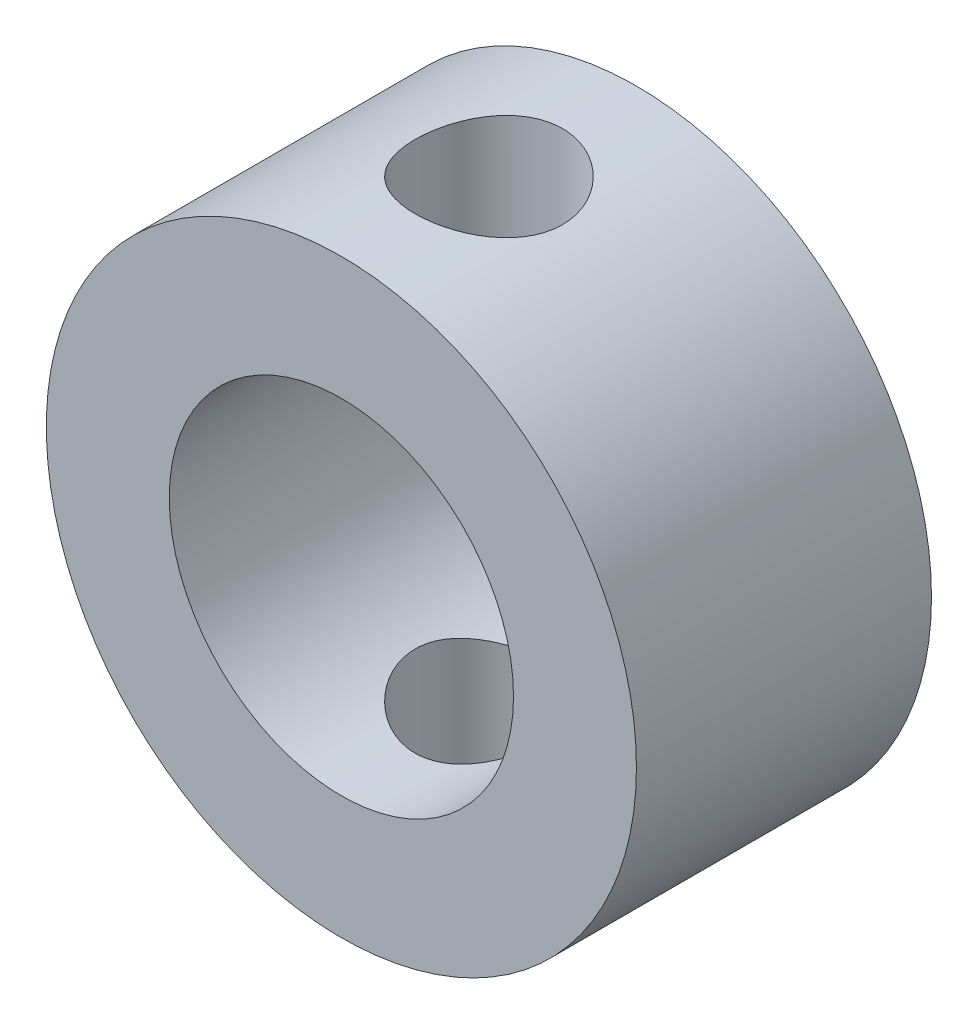
ISO-10303-21;
HEADER;
FILE_DESCRIPTION(('STEP AP214'),'2;1');
FILE_NAME('part.step','',(''),(''),'','','');
FILE_SCHEMA(('AUTOMOTIVE_DESIGN { 1 0 10303 214 1 1 1 1 }'));
ENDSEC;
DATA;
#1=APPLICATION_CONTEXT('core data for automotive mechanical design processes');
#2=APPLICATION_PROTOCOL_DEFINITION('international standard','automotive_design',2000,#1);
#3=PRODUCT_CONTEXT('',#1,'mechanical');
#4=PRODUCT('Part','Part','',(#3));
#5=PRODUCT_RELATED_PRODUCT_CATEGORY('part','',(#4));
#6=PRODUCT_DEFINITION_FORMATION('','',#4);
#7=PRODUCT_DEFINITION_CONTEXT('part definition',#1,'design');
#8=PRODUCT_DEFINITION('design','',#6,#7);
#9=PRODUCT_DEFINITION_SHAPE('','',#8);
#10=(LENGTH_UNIT() NAMED_UNIT(*) SI_UNIT(.MILLI.,.METRE.));
#11=(NAMED_UNIT(*) PLANE_ANGLE_UNIT() SI_UNIT($,.RADIAN.));
#12=(NAMED_UNIT(*) SI_UNIT($,.STERADIAN.) SOLID_ANGLE_UNIT());
#13=UNCERTAINTY_MEASURE_WITH_UNIT(LENGTH_MEASURE(1.E-05),#10,'distance_accuracy_value','');
#14=(GEOMETRIC_REPRESENTATION_CONTEXT(3) GLOBAL_UNCERTAINTY_ASSIGNED_CONTEXT((#13)) GLOBAL_UNIT_ASSIGNED_CONTEXT((#10,
#11,#12)) REPRESENTATION_CONTEXT('',''));
#15=CARTESIAN_POINT('',(0.,0.,0.));
#16=DIRECTION('',(0.,0.,1.));
#17=DIRECTION('',(1.,0.,0.));
#18=AXIS2_PLACEMENT_3D('',#15,#16,#17);
#19=CARTESIAN_POINT('',(0.,0.,12.));
#20=DIRECTION('',(0.,0.,1.));
#21=DIRECTION('',(1.,0.,0.));
#22=AXIS2_PLACEMENT_3D('',#19,#20,#21);
#23=PLANE('',#22);
#24=CARTESIAN_POINT('',(0.,0.,12.));
#25=DIRECTION('',(0.,0.,1.));
#26=DIRECTION('',(1.,0.,0.));
#27=AXIS2_PLACEMENT_3D('',#24,#25,#26);
#28=CIRCLE('',#27,12.);
#29=CARTESIAN_POINT('',(12.,0.,12.));
#30=VERTEX_POINT('',#29);
#31=EDGE_CURVE('E10',#30,#30,#28,.T.);
#32=ORIENTED_EDGE('',*,*,#31,.T.);
#33=EDGE_LOOP('',(#32));
#34=FACE_BOUND('',#33,.T.);
#35=CARTESIAN_POINT('',(0.,0.,12.));
#36=DIRECTION('',(0.,0.,1.));
#37=DIRECTION('',(1.,0.,0.));
#38=AXIS2_PLACEMENT_3D('',#35,#36,#37);
#39=CIRCLE('',#38,7.);
#40=CARTESIAN_POINT('',(7.,0.,12.));
#41=VERTEX_POINT('',#40);
#42=EDGE_CURVE('E49',#41,#41,#39,.T.);
#43=ORIENTED_EDGE('',*,*,#42,.F.);
#44=EDGE_LOOP('',(#43));
#45=FACE_BOUND('',#44,.T.);
#46=ADVANCED_FACE('F31',(#34,#45),#23,.T.);
#47=CARTESIAN_POINT('',(0.,0.,0.));
#48=DIRECTION('',(0.,0.,1.));
#49=DIRECTION('',(1.,0.,0.));
#50=AXIS2_PLACEMENT_3D('',#47,#48,#49);
#51=PLANE('',#50);
#52=CARTESIAN_POINT('',(0.,0.,0.));
#53=DIRECTION('',(0.,0.,1.));
#54=DIRECTION('',(1.,0.,0.));
#55=AXIS2_PLACEMENT_3D('',#52,#53,#54);
#56=CIRCLE('',#55,12.);
#57=CARTESIAN_POINT('',(12.,0.,0.));
#58=VERTEX_POINT('',#57);
#59=EDGE_CURVE('E44',#58,#58,#56,.T.);
#60=ORIENTED_EDGE('',*,*,#59,.F.);
#61=EDGE_LOOP('',(#60));
#62=FACE_BOUND('',#61,.T.);
#63=CARTESIAN_POINT('',(0.,0.,0.));
#64=DIRECTION('',(0.,0.,1.));
#65=DIRECTION('',(1.,0.,0.));
#66=AXIS2_PLACEMENT_3D('',#63,#64,#65);
#67=CIRCLE('',#66,7.);
#68=CARTESIAN_POINT('',(7.,0.,0.));
#69=VERTEX_POINT('',#68);
#70=EDGE_CURVE('E52',#69,#69,#67,.T.);
#71=ORIENTED_EDGE('',*,*,#70,.T.);
#72=EDGE_LOOP('',(#71));
#73=FACE_BOUND('',#72,.T.);
#74=ADVANCED_FACE('F85',(#62,#73),#51,.F.);
#75=CARTESIAN_POINT('',(0.,0.,12.));
#76=DIRECTION('',(0.,0.,-1.));
#77=DIRECTION('',(-1.,0.,0.));
#78=AXIS2_PLACEMENT_3D('',#75,#76,#77);
#79=CYLINDRICAL_SURFACE('',#78,12.);
#80=CARTESIAN_POINT('',(0.,-12.,9.));
#81=CARTESIAN_POINT('',(0.165752177339466,-11.9999971973602,8.99999534852368));
#82=CARTESIAN_POINT('',(0.33155631566153,-11.9965315626365,8.98621689845243));
#83=CARTESIAN_POINT('',(0.658412647541069,-11.9830422765979,8.93154969738599));
#84=CARTESIAN_POINT('',(0.819462093741482,-11.9730149083995,8.8906455809243));
#85=CARTESIAN_POINT('',(1.13204174436516,-11.9475125266406,8.78312149307583));
#86=CARTESIAN_POINT('',(1.28358312686001,-11.9320440568412,8.71653240256946));
#87=CARTESIAN_POINT('',(1.57334426380886,-11.8973068761524,8.55963721991032));
#88=CARTESIAN_POINT('',(1.71156356869753,-11.8780380370831,8.46933032776206));
#89=CARTESIAN_POINT('',(1.97360385460183,-11.8373482718339,8.26559842069164));
#90=CARTESIAN_POINT('',(2.09711138012212,-11.8158941429625,8.15177685008188));
#91=CARTESIAN_POINT('',(2.32349785440664,-11.7734724023587,7.90509559018193));
#92=CARTESIAN_POINT('',(2.42637447389839,-11.7525048457974,7.77223375410613));
#93=CARTESIAN_POINT('',(2.61005308559795,-11.7130955139634,7.48880954652602));
#94=CARTESIAN_POINT('',(2.69050443185028,-11.6946958892962,7.33801353838254));
#95=CARTESIAN_POINT('',(2.82479381710149,-11.6629898963603,7.02450317667993));
#96=CARTESIAN_POINT('',(2.87863611088029,-11.6496827138884,6.86179073333597));
#97=CARTESIAN_POINT('',(2.95710967360953,-11.6300095339265,6.53251300359668));
#98=CARTESIAN_POINT('',(2.98230453666411,-11.6235098199402,6.36609020792401));
#99=CARTESIAN_POINT('',(3.00452355013282,-11.6177872491918,6.03126286200131));
#100=CARTESIAN_POINT('',(3.00155228363623,-11.6185632085586,5.86285863861572));
#101=CARTESIAN_POINT('',(2.96797304927941,-11.6271841103363,5.53316838450929));
#102=CARTESIAN_POINT('',(2.93803668038127,-11.6348572601459,5.37180875706934));
#103=CARTESIAN_POINT('',(2.85244837380599,-11.6561341934214,5.05647789817788));
#104=CARTESIAN_POINT('',(2.79679460413879,-11.6697383993848,4.90250719394216));
#105=CARTESIAN_POINT('',(2.66077895587437,-11.7015022781132,4.60452396749574));
#106=CARTESIAN_POINT('',(2.58017333446584,-11.7197065493963,4.46062765642086));
#107=CARTESIAN_POINT('',(2.39671255202989,-11.7585942169198,4.18816258048636));
#108=CARTESIAN_POINT('',(2.29385349761768,-11.7792780466926,4.0595965038655));
#109=CARTESIAN_POINT('',(2.06532684936244,-11.8215176107978,3.81759276861119));
#110=CARTESIAN_POINT('',(1.93909251633172,-11.84308138956,3.7046910198773));
#111=CARTESIAN_POINT('',(1.6692238350074,-11.8841193115751,3.50155751507219));
#112=CARTESIAN_POINT('',(1.52558895541589,-11.9035933909882,3.41132645147287));
#113=CARTESIAN_POINT('',(1.22423177736279,-11.9383546418838,3.25589882755123));
#114=CARTESIAN_POINT('',(1.06646278641725,-11.9536272025545,3.19078931949114));
#115=CARTESIAN_POINT('',(0.741752016285768,-11.9781583398283,3.08816538858085));
#116=CARTESIAN_POINT('',(0.574811998300971,-11.9874180667856,3.05064568716372));
#117=CARTESIAN_POINT('',(0.241079940780055,-11.9987099854275,3.00508486888232));
#118=CARTESIAN_POINT('',(0.0743934399764211,-12.0009210701655,2.9963139478494));
#119=CARTESIAN_POINT('',(-0.258065749603016,-11.998376096289,3.00649800411098));
#120=CARTESIAN_POINT('',(-0.423838519289191,-11.9936206648371,3.02545048559827));
#121=CARTESIAN_POINT('',(-0.747228537552979,-11.977791622547,3.08994181678275));
#122=CARTESIAN_POINT('',(-0.904930237937499,-11.9668126837158,3.13508252695395));
#123=CARTESIAN_POINT('',(-1.21051458490503,-11.9397741326831,3.25021416805692));
#124=CARTESIAN_POINT('',(-1.3583962380653,-11.9237140073996,3.32020760862644));
#125=CARTESIAN_POINT('',(-1.64304626885966,-11.8878661585244,3.48447225774935));
#126=CARTESIAN_POINT('',(-1.77957088367153,-11.868017347332,3.57915222479313));
#127=CARTESIAN_POINT('',(-2.03505322728662,-11.826890183755,3.78957981759434));
#128=CARTESIAN_POINT('',(-2.15400791794649,-11.8056115850589,3.9053310792353));
#129=CARTESIAN_POINT('',(-2.37398113614497,-11.76337913919,4.15800392168741));
#130=CARTESIAN_POINT('',(-2.4744877352422,-11.7424460836496,4.29537540599912));
#131=CARTESIAN_POINT('',(-2.65102151802725,-11.7038575676408,4.58546526893716));
#132=CARTESIAN_POINT('',(-2.72704978832281,-11.6862019616993,4.73818296594089));
#133=CARTESIAN_POINT('',(-2.85190284121468,-11.656361894336,5.05381144481248));
#134=CARTESIAN_POINT('',(-2.90088879328717,-11.6441451045097,5.2166552566246));
#135=CARTESIAN_POINT('',(-2.97069131988587,-11.626534880479,5.54861927571059));
#136=CARTESIAN_POINT('',(-2.99151405495182,-11.6211399540485,5.7177381020429));
#137=CARTESIAN_POINT('',(-3.00407718067299,-11.6178980244194,6.05224204772322));
#138=CARTESIAN_POINT('',(-2.99663579556157,-11.6198386546564,6.21759487025289));
#139=CARTESIAN_POINT('',(-2.95475455662439,-11.6305581800657,6.54460777733253));
#140=CARTESIAN_POINT('',(-2.92031524537318,-11.6393369378128,6.70626793602638));
#141=CARTESIAN_POINT('',(-2.82586263888594,-11.6626252136787,7.02041691813173));
#142=CARTESIAN_POINT('',(-2.76600280936084,-11.6771003047327,7.17295461048066));
#143=CARTESIAN_POINT('',(-2.62252982721004,-11.7101551144901,7.46593076542714));
#144=CARTESIAN_POINT('',(-2.53891338006835,-11.7287354024137,7.60636754637377));
#145=CARTESIAN_POINT('',(-2.34773549727429,-11.7685126852721,7.87510925800411));
#146=CARTESIAN_POINT('',(-2.23960632582451,-11.7897652966356,8.00300214684794));
#147=CARTESIAN_POINT('',(-2.00357874237946,-11.8321605449252,8.2390940895908));
#148=CARTESIAN_POINT('',(-1.87567564252228,-11.8533031545411,8.34728846022593));
#149=CARTESIAN_POINT('',(-1.60093517340518,-11.8935531129534,8.54282261712922));
#150=CARTESIAN_POINT('',(-1.45379684463277,-11.9126166673174,8.62974922734316));
#151=CARTESIAN_POINT('',(-1.14653211902095,-11.9460984995023,8.77749492588106));
#152=CARTESIAN_POINT('',(-0.986415126873474,-11.9605201039956,8.83833272129707));
#153=CARTESIAN_POINT('',(-0.688820506486939,-11.9809611913108,8.92314366065931));
#154=CARTESIAN_POINT('',(-0.552760341816133,-11.9880517010538,8.95190248610687));
#155=CARTESIAN_POINT('',(-0.277812143072562,-11.997572104639,8.99033188724388));
#156=CARTESIAN_POINT('',(-0.138924322485229,-12.0000023490179,9.0000038986106));
#157=CARTESIAN_POINT('',(0.,-12.,9.));
#158=B_SPLINE_CURVE_WITH_KNOTS('',3,(#80,#81,#82,#83,#84,#85,#86,#87,#88,#89,#90,#91,#92,#93,
#94,#95,#96,#97,#98,#99,#100,#101,#102,#103,#104,#105,#106,#107,#108,#109,#110,#111,#112,#113,
#114,#115,#116,#117,#118,#119,#120,#121,#122,#123,#124,#125,#126,#127,#128,#129,#130,#131,#132,
#133,#134,#135,#136,#137,#138,#139,#140,#141,#142,#143,#144,#145,#146,#147,#148,#149,#150,#151,
#152,#153,#154,#155,#156,#157),.UNSPECIFIED.,.T.,.F.,(4,2,2,2,2,2,2,2,2,2,2,2,2,2,2,2,2,2,2,2,2,
2,2,2,2,2,2,2,2,2,2,2,2,2,2,2,2,2,4),(0.,0.496747424943779,0.993776475527799,1.49020980457221,
1.98665988033866,2.49228870874278,2.99797459160124,3.51117295091614,4.02428922338737,
4.5271259020214,5.02988076232035,5.52044994020678,6.01105406938718,6.506610557544,
7.00225381678967,7.5120300194468,8.02182179123136,8.5333645802487,9.04480947383927,
9.54316617905194,10.0414780223213,10.5324054903472,11.0233825465122,11.5230717513735,
12.0228472602268,12.5348901841559,13.0469103750566,13.5558450923716,14.0646684651657,
14.5588756080898,15.0530728192383,15.5443280113065,16.0356513628556,16.5397915283158,
17.0440513955259,17.5574437101093,18.0704672765446,18.4868448589605,18.9031911209784),.UNSPECIFIED.);
#159=CARTESIAN_POINT('',(0.,-12.,9.));
#160=VERTEX_POINT('',#159);
#161=EDGE_CURVE('E75',#160,#160,#158,.T.);
#162=ORIENTED_EDGE('',*,*,#161,.T.);
#163=EDGE_LOOP('',(#162));
#164=FACE_BOUND('',#163,.T.);
#165=CARTESIAN_POINT('',(0.,12.,9.));
#166=CARTESIAN_POINT('',(-0.165752177339462,11.9999971973602,8.99999534852368));
#167=CARTESIAN_POINT('',(-0.331556315661526,11.9965315626365,8.98621689845242));
#168=CARTESIAN_POINT('',(-0.658412647541065,11.9830422765979,8.93154969738599));
#169=CARTESIAN_POINT('',(-0.819462093741479,11.9730149083995,8.8906455809243));
#170=CARTESIAN_POINT('',(-1.13204174436515,11.9475125266406,8.78312149307583));
#171=CARTESIAN_POINT('',(-1.28358312686,11.9320440568412,8.71653240256946));
#172=CARTESIAN_POINT('',(-1.57334426380886,11.8973068761524,8.55963721991031));
#173=CARTESIAN_POINT('',(-1.71156356869753,11.8780380370831,8.46933032776206));
#174=CARTESIAN_POINT('',(-1.97360385460183,11.8373482718339,8.26559842069164));
#175=CARTESIAN_POINT('',(-2.09711138012211,11.8158941429625,8.15177685008188));
#176=CARTESIAN_POINT('',(-2.32349785440664,11.7734724023587,7.90509559018193));
#177=CARTESIAN_POINT('',(-2.42637447389838,11.7525048457974,7.77223375410612));
#178=CARTESIAN_POINT('',(-2.61005308559795,11.7130955139634,7.48880954652601));
#179=CARTESIAN_POINT('',(-2.69050443185028,11.6946958892962,7.33801353838254));
#180=CARTESIAN_POINT('',(-2.82479381710149,11.6629898963603,7.02450317667992));
#181=CARTESIAN_POINT('',(-2.87863611088028,11.6496827138884,6.86179073333596));
#182=CARTESIAN_POINT('',(-2.95710967360953,11.6300095339265,6.53251300359668));
#183=CARTESIAN_POINT('',(-2.9823045366641,11.6235098199402,6.36609020792401));
#184=CARTESIAN_POINT('',(-3.00452355013281,11.6177872491918,6.0312628620013));
#185=CARTESIAN_POINT('',(-3.00155228363622,11.6185632085586,5.86285863861572));
#186=CARTESIAN_POINT('',(-2.96797304927941,11.6271841103363,5.53316838450929));
#187=CARTESIAN_POINT('',(-2.93803668038126,11.6348572601459,5.37180875706934));
#188=CARTESIAN_POINT('',(-2.85244837380598,11.6561341934214,5.05647789817788));
#189=CARTESIAN_POINT('',(-2.79679460413878,11.6697383993848,4.90250719394216));
#190=CARTESIAN_POINT('',(-2.66077895587436,11.7015022781132,4.60452396749574));
#191=CARTESIAN_POINT('',(-2.58017333446583,11.7197065493963,4.46062765642086));
#192=CARTESIAN_POINT('',(-2.39671255202989,11.7585942169198,4.18816258048636));
#193=CARTESIAN_POINT('',(-2.29385349761767,11.7792780466926,4.0595965038655));
#194=CARTESIAN_POINT('',(-2.06532684936244,11.8215176107978,3.81759276861119));
#195=CARTESIAN_POINT('',(-1.93909251633172,11.84308138956,3.7046910198773));
#196=CARTESIAN_POINT('',(-1.66922383500739,11.8841193115751,3.50155751507219));
#197=CARTESIAN_POINT('',(-1.52558895541588,11.9035933909882,3.41132645147287));
#198=CARTESIAN_POINT('',(-1.22423177736278,11.9383546418838,3.25589882755123));
#199=CARTESIAN_POINT('',(-1.06646278641724,11.9536272025545,3.19078931949114));
#200=CARTESIAN_POINT('',(-0.741752016285759,11.9781583398283,3.08816538858085));
#201=CARTESIAN_POINT('',(-0.574811998300963,11.9874180667856,3.05064568716372));
#202=CARTESIAN_POINT('',(-0.241079940780047,11.9987099854275,3.00508486888232));
#203=CARTESIAN_POINT('',(-0.0743934399764138,12.0009210701655,2.9963139478494));
#204=CARTESIAN_POINT('',(0.258065749603023,11.998376096289,3.00649800411098));
#205=CARTESIAN_POINT('',(0.423838519289199,11.9936206648371,3.02545048559827));
#206=CARTESIAN_POINT('',(0.747228537552988,11.977791622547,3.08994181678275));
#207=CARTESIAN_POINT('',(0.904930237937507,11.9668126837158,3.13508252695395));
#208=CARTESIAN_POINT('',(1.21051458490504,11.9397741326831,3.25021416805692));
#209=CARTESIAN_POINT('',(1.35839623806531,11.9237140073996,3.32020760862645));
#210=CARTESIAN_POINT('',(1.64304626885967,11.8878661585244,3.48447225774935));
#211=CARTESIAN_POINT('',(1.77957088367154,11.868017347332,3.57915222479313));
#212=CARTESIAN_POINT('',(2.03505322728663,11.826890183755,3.78957981759434));
#213=CARTESIAN_POINT('',(2.1540079179465,11.8056115850589,3.9053310792353));
#214=CARTESIAN_POINT('',(2.37398113614497,11.76337913919,4.15800392168742));
#215=CARTESIAN_POINT('',(2.47448773524221,11.7424460836496,4.29537540599912));
#216=CARTESIAN_POINT('',(2.65102151802726,11.7038575676408,4.58546526893716));
#217=CARTESIAN_POINT('',(2.72704978832282,11.6862019616993,4.73818296594089));
#218=CARTESIAN_POINT('',(2.85190284121469,11.656361894336,5.05381144481248));
#219=CARTESIAN_POINT('',(2.90088879328718,11.6441451045097,5.2166552566246));
#220=CARTESIAN_POINT('',(2.97069131988587,11.626534880479,5.54861927571059));
#221=CARTESIAN_POINT('',(2.99151405495183,11.6211399540485,5.7177381020429));
#222=CARTESIAN_POINT('',(3.004077180673,11.6178980244194,6.05224204772322));
#223=CARTESIAN_POINT('',(2.99663579556158,11.6198386546564,6.2175948702529));
#224=CARTESIAN_POINT('',(2.95475455662439,11.6305581800657,6.54460777733253));
#225=CARTESIAN_POINT('',(2.92031524537318,11.6393369378128,6.70626793602639));
#226=CARTESIAN_POINT('',(2.82586263888595,11.6626252136787,7.02041691813173));
#227=CARTESIAN_POINT('',(2.76600280936085,11.6771003047327,7.17295461048066));
#228=CARTESIAN_POINT('',(2.62252982721005,11.7101551144901,7.46593076542714));
#229=CARTESIAN_POINT('',(2.53891338006835,11.7287354024137,7.60636754637377));
#230=CARTESIAN_POINT('',(2.3477354972743,11.7685126852721,7.87510925800411));
#231=CARTESIAN_POINT('',(2.23960632582452,11.7897652966356,8.00300214684794));
#232=CARTESIAN_POINT('',(2.00357874237947,11.8321605449252,8.2390940895908));
#233=CARTESIAN_POINT('',(1.87567564252229,11.8533031545411,8.34728846022593));
#234=CARTESIAN_POINT('',(1.60093517340518,11.8935531129534,8.54282261712922));
#235=CARTESIAN_POINT('',(1.45379684463277,11.9126166673174,8.62974922734316));
#236=CARTESIAN_POINT('',(1.14653211902095,11.9460984995023,8.77749492588106));
#237=CARTESIAN_POINT('',(0.986415126873479,11.9605201039956,8.83833272129707));
#238=CARTESIAN_POINT('',(0.688820506486944,11.9809611913108,8.92314366065931));
#239=CARTESIAN_POINT('',(0.552760341816137,11.9880517010538,8.95190248610687));
#240=CARTESIAN_POINT('',(0.277812143072567,11.997572104639,8.99033188724388));
#241=CARTESIAN_POINT('',(0.138924322485233,12.0000023490179,9.0000038986106));
#242=CARTESIAN_POINT('',(0.,12.,9.));
#243=B_SPLINE_CURVE_WITH_KNOTS('',3,(#165,#166,#167,#168,#169,#170,#171,#172,#173,#174,#175,
#176,#177,#178,#179,#180,#181,#182,#183,#184,#185,#186,#187,#188,#189,#190,#191,#192,#193,#194,
#195,#196,#197,#198,#199,#200,#201,#202,#203,#204,#205,#206,#207,#208,#209,#210,#211,#212,#213,
#214,#215,#216,#217,#218,#219,#220,#221,#222,#223,#224,#225,#226,#227,#228,#229,#230,#231,#232,
#233,#234,#235,#236,#237,#238,#239,#240,#241,#242),.UNSPECIFIED.,.T.,.F.,(4,2,2,2,2,2,2,2,2,2,2,
2,2,2,2,2,2,2,2,2,2,2,2,2,2,2,2,2,2,2,2,2,2,2,2,2,2,2,4),(0.,0.496747424943779,
0.993776475527799,1.49020980457221,1.98665988033866,2.49228870874278,2.99797459160124,
3.51117295091614,4.02428922338737,4.5271259020214,5.02988076232035,5.52044994020677,
6.01105406938718,6.506610557544,7.00225381678967,7.5120300194468,8.02182179123135,
8.53336458024869,9.04480947383927,9.54316617905194,10.0414780223213,10.5324054903472,
11.0233825465122,11.5230717513735,12.0228472602268,12.5348901841559,13.0469103750566,
13.5558450923716,14.0646684651657,14.5588756080898,15.0530728192382,15.5443280113065,
16.0356513628556,16.5397915283158,17.0440513955259,17.5574437101093,18.0704672765446,
18.4868448589605,18.9031911209784),.UNSPECIFIED.);
#244=CARTESIAN_POINT('',(0.,12.,9.));
#245=VERTEX_POINT('',#244);
#246=EDGE_CURVE('E71',#245,#245,#243,.T.);
#247=ORIENTED_EDGE('',*,*,#246,.T.);
#248=EDGE_LOOP('',(#247));
#249=FACE_BOUND('',#248,.T.);
#250=ORIENTED_EDGE('',*,*,#31,.F.);
#251=EDGE_LOOP('',(#250));
#252=FACE_BOUND('',#251,.T.);
#253=ORIENTED_EDGE('',*,*,#59,.T.);
#254=EDGE_LOOP('',(#253));
#255=FACE_BOUND('',#254,.T.);
#256=ADVANCED_FACE('F33',(#164,#249,#252,#255),#79,.T.);
#257=CARTESIAN_POINT('',(0.,0.,12.));
#258=DIRECTION('',(0.,0.,-1.));
#259=DIRECTION('',(-1.,0.,0.));
#260=AXIS2_PLACEMENT_3D('',#257,#258,#259);
#261=CYLINDRICAL_SURFACE('',#260,7.);
#262=CARTESIAN_POINT('',(0.,-7.,9.));
#263=CARTESIAN_POINT('',(0.160281740269094,-6.9999940839629,8.99999253041855));
#264=CARTESIAN_POINT('',(0.320833907522433,-6.99443250051265,8.98707868390345));
#265=CARTESIAN_POINT('',(0.637349314958988,-6.97273920628719,8.93591763457354));
#266=CARTESIAN_POINT('',(0.793299928144209,-6.95658080950724,8.89760647092665));
#267=CARTESIAN_POINT('',(1.0955347051483,-6.91541630739346,8.79733023637488));
#268=CARTESIAN_POINT('',(1.24185033642246,-6.89044089228941,8.7354471561946));
#269=CARTESIAN_POINT('',(1.5218733278968,-6.83405660276648,8.59013558143627));
#270=CARTESIAN_POINT('',(1.65558409053381,-6.80264947176647,8.5067129239082));
#271=CARTESIAN_POINT('',(1.91384144205639,-6.73467821875549,8.3160723523121));
#272=CARTESIAN_POINT('',(2.03764045493603,-6.69793895962371,8.20790474010422));
#273=CARTESIAN_POINT('',(2.26599040232609,-6.62417654338771,7.97285613149923));
#274=CARTESIAN_POINT('',(2.3705306503261,-6.5871532404671,7.84596481539728));
#275=CARTESIAN_POINT('',(2.56285686126493,-6.51482055271223,7.5689672772845));
#276=CARTESIAN_POINT('',(2.64946811752636,-6.47970460244924,7.41798954197069));
#277=CARTESIAN_POINT('',(2.79573199408101,-6.41796168635026,7.10189057181104));
#278=CARTESIAN_POINT('',(2.8553992914263,-6.39133010120133,6.93677709551375));
#279=CARTESIAN_POINT('',(2.94294919918375,-6.35147799087276,6.60569926169075));
#280=CARTESIAN_POINT('',(2.97227494401777,-6.33765221435539,6.44019229822055));
#281=CARTESIAN_POINT('',(3.00280607158394,-6.32324849688131,6.10607403038965));
#282=CARTESIAN_POINT('',(3.00402828615096,-6.32266262625149,5.93746464470862));
#283=CARTESIAN_POINT('',(2.97939999510613,-6.33429573902539,5.61670009628145));
#284=CARTESIAN_POINT('',(2.95576113815072,-6.34546870930158,5.46432937666801));
#285=CARTESIAN_POINT('',(2.88580772808799,-6.37758411517576,5.16597241409867));
#286=CARTESIAN_POINT('',(2.83948852833539,-6.39852855266591,5.01998748611386));
#287=CARTESIAN_POINT('',(2.72457659070691,-6.44830685655465,4.73475284856477));
#288=CARTESIAN_POINT('',(2.65551974428426,-6.47730295111391,4.59571970578185));
#289=CARTESIAN_POINT('',(2.49742304873013,-6.53988493882129,4.33065367593057));
#290=CARTESIAN_POINT('',(2.4083750748049,-6.57347269593628,4.20462610507051));
#291=CARTESIAN_POINT('',(2.20343405392229,-6.64512404535213,3.95722249637862));
#292=CARTESIAN_POINT('',(2.08584728856133,-6.68331855389208,3.83728327052803));
#293=CARTESIAN_POINT('',(1.83187332405077,-6.75734605758523,3.61832840934405));
#294=CARTESIAN_POINT('',(1.6954812162799,-6.79317843254652,3.51931825412179));
#295=CARTESIAN_POINT('',(1.40318582301272,-6.8595969368957,3.34275606719303));
#296=CARTESIAN_POINT('',(1.24687114970232,-6.89002455033727,3.26582098129442));
#297=CARTESIAN_POINT('',(0.921879694158938,-6.94097396260558,3.13984976238528));
#298=CARTESIAN_POINT('',(0.753210215657668,-6.9615015603998,3.0907972940223));
#299=CARTESIAN_POINT('',(0.420276238941373,-6.98923526893385,3.02506613954103));
#300=CARTESIAN_POINT('',(0.256457961010927,-6.99723249964589,3.00646123468561));
#301=CARTESIAN_POINT('',(-0.0721433011185043,-7.00155416651738,2.99637042359177));
#302=CARTESIAN_POINT('',(-0.236925971900554,-6.99788220531666,3.00487614746763));
#303=CARTESIAN_POINT('',(-0.553542439626669,-6.9797867632015,3.04741563205481));
#304=CARTESIAN_POINT('',(-0.705598931504215,-6.96594519473644,3.08006832144833));
#305=CARTESIAN_POINT('',(-1.00189113639242,-6.92953888009974,3.16802089423817));
#306=CARTESIAN_POINT('',(-1.14612587370002,-6.90697304848521,3.22332359572216));
#307=CARTESIAN_POINT('',(-1.42777696523888,-6.8543875151372,3.35680115950212));
#308=CARTESIAN_POINT('',(-1.56483974951836,-6.82415705388474,3.43563633022606));
#309=CARTESIAN_POINT('',(-1.82428490564705,-6.75942988391438,3.61321894447594));
#310=CARTESIAN_POINT('',(-1.94666097512992,-6.72493135648758,3.71197488802329));
#311=CARTESIAN_POINT('',(-2.18296759532595,-6.65214788697903,3.9352895878429));
#312=CARTESIAN_POINT('',(-2.29556617553685,-6.61377354998591,4.06123221006139));
#313=CARTESIAN_POINT('',(-2.49843431443676,-6.53984037690253,4.33078229863161));
#314=CARTESIAN_POINT('',(-2.58869766421195,-6.50428232556792,4.47439466037483));
#315=CARTESIAN_POINT('',(-2.74563875632303,-6.4396296928532,4.77881385295857));
#316=CARTESIAN_POINT('',(-2.81186415020233,-6.41066255987443,4.93988300904999));
#317=CARTESIAN_POINT('',(-2.91565885028324,-6.36413607530145,5.2725263267395));
#318=CARTESIAN_POINT('',(-2.95325364225747,-6.346566580073,5.44409099832458));
#319=CARTESIAN_POINT('',(-2.99611948419969,-6.32643481136621,5.77799117233295));
#320=CARTESIAN_POINT('',(-3.00374693238451,-6.3227792566546,5.93995926751059));
#321=CARTESIAN_POINT('',(-2.99282649265777,-6.32795618271386,6.2627897469115));
#322=CARTESIAN_POINT('',(-2.97428322126542,-6.33678646098226,6.42365232111928));
#323=CARTESIAN_POINT('',(-2.91356431394149,-6.36491653890771,6.73104169627336));
#324=CARTESIAN_POINT('',(-2.87266975661121,-6.38364713099396,6.87787879157075));
#325=CARTESIAN_POINT('',(-2.769702223632,-6.42898875831973,7.16262076608388));
#326=CARTESIAN_POINT('',(-2.70762322652258,-6.45560203384716,7.30052309240773));
#327=CARTESIAN_POINT('',(-2.55963250501148,-6.5157524732596,7.57282070867956));
#328=CARTESIAN_POINT('',(-2.47248232196069,-6.5496164957701,7.70646915369476));
#329=CARTESIAN_POINT('',(-2.27849600925129,-6.61959778926567,7.95798236124754));
#330=CARTESIAN_POINT('',(-2.17165243666714,-6.6557159087398,8.07584112704921));
#331=CARTESIAN_POINT('',(-1.93135048700132,-6.72955424641834,8.30200363550072));
#332=CARTESIAN_POINT('',(-1.79645724733278,-6.76717599448736,8.40881956557276));
#333=CARTESIAN_POINT('',(-1.50919760355,-6.83696477009089,8.59843976003117));
#334=CARTESIAN_POINT('',(-1.35682332068822,-6.86912932173673,8.68123313759985));
#335=CARTESIAN_POINT('',(-1.11954532843041,-6.91035442086788,8.78459269098953));
#336=CARTESIAN_POINT('',(-1.0395728802483,-6.92286397965452,8.81543329080184));
#337=CARTESIAN_POINT('',(-0.876970802782693,-6.94533202163241,8.8702382020223));
#338=CARTESIAN_POINT('',(-0.794342461515163,-6.95529172101822,8.89420579227536));
#339=CARTESIAN_POINT('',(-0.627265567421394,-6.97234378079151,8.93494771728342));
#340=CARTESIAN_POINT('',(-0.542821986677283,-6.97944312738119,8.95173958438048));
#341=CARTESIAN_POINT('',(-0.372647906839311,-6.99059319635283,8.97800871420341));
#342=CARTESIAN_POINT('',(-0.286918376030201,-6.99464610559385,8.9874912240139));
#343=CARTESIAN_POINT('',(-0.167492669563771,-6.99807592564235,8.99550827494356));
#344=CARTESIAN_POINT('',(-0.134021137958661,-6.99879677015532,8.99719185411763));
#345=CARTESIAN_POINT('',(-0.0670370145842062,-6.99975942751561,8.99943850128407));
#346=CARTESIAN_POINT('',(-0.0335244225617017,-7.0000012373944,9.00000156233271));
#347=CARTESIAN_POINT('',(0.,-7.,9.));
#348=B_SPLINE_CURVE_WITH_KNOTS('',3,(#262,#263,#264,#265,#266,#267,#268,#269,#270,#271,#272,
#273,#274,#275,#276,#277,#278,#279,#280,#281,#282,#283,#284,#285,#286,#287,#288,#289,#290,#291,
#292,#293,#294,#295,#296,#297,#298,#299,#300,#301,#302,#303,#304,#305,#306,#307,#308,#309,#310,
#311,#312,#313,#314,#315,#316,#317,#318,#319,#320,#321,#322,#323,#324,#325,#326,#327,#328,#329,
#330,#331,#332,#333,#334,#335,#336,#337,#338,#339,#340,#341,#342,#343,#344,#345,#346,#347),
.UNSPECIFIED.,.T.,.F.,(4,2,2,2,2,2,2,2,2,2,2,2,2,2,2,2,2,2,2,2,2,2,2,2,2,2,2,2,2,2,2,2,2,2,2,2,
2,2,2,2,2,2,4),(0.,0.480714322748849,0.962643903423347,1.44291226275142,1.92305060961531,
2.42622743558506,2.92968263421743,3.45969560860062,3.98941952228263,4.492594268281,
4.99546764377915,5.45710720323576,5.91884138089948,6.3906540887232,6.86265889892286,
7.37709837725841,7.89167239108963,8.41947244601234,8.94696296364742,9.43957347502028,
9.93203191709568,10.3983119423363,10.8646499992176,11.3455505516221,11.8266567358409,
12.3440285038672,12.8615439335848,13.3883469079738,13.9146803943341,14.3986848887267,
14.882604015318,15.341320451094,15.8001673810816,16.2874475008663,16.7749121624767,
17.3008416934143,17.8270092002163,18.0865840789243,18.3460349177801,18.6048481685098,
18.8634754544625,18.964020720529,19.0645666096629),.UNSPECIFIED.);
#349=CARTESIAN_POINT('',(0.,-7.,9.));
#350=VERTEX_POINT('',#349);
#351=EDGE_CURVE('E36',#350,#350,#348,.T.);
#352=ORIENTED_EDGE('',*,*,#351,.F.);
#353=EDGE_LOOP('',(#352));
#354=FACE_BOUND('',#353,.T.);
#355=CARTESIAN_POINT('',(0.,7.,9.));
#356=CARTESIAN_POINT('',(-0.160281740269088,6.9999940839629,8.99999253041855));
#357=CARTESIAN_POINT('',(-0.320833907522426,6.99443250051265,8.98707868390345));
#358=CARTESIAN_POINT('',(-0.637349314958981,6.97273920628719,8.93591763457354));
#359=CARTESIAN_POINT('',(-0.793299928144203,6.95658080950724,8.89760647092665));
#360=CARTESIAN_POINT('',(-1.09553470514829,6.91541630739346,8.79733023637488));
#361=CARTESIAN_POINT('',(-1.24185033642245,6.89044089228941,8.7354471561946));
#362=CARTESIAN_POINT('',(-1.5218733278968,6.83405660276648,8.59013558143627));
#363=CARTESIAN_POINT('',(-1.6555840905338,6.80264947176647,8.5067129239082));
#364=CARTESIAN_POINT('',(-1.91384144205638,6.7346782187555,8.3160723523121));
#365=CARTESIAN_POINT('',(-2.03764045493602,6.69793895962371,8.20790474010422));
#366=CARTESIAN_POINT('',(-2.26599040232609,6.62417654338771,7.97285613149922));
#367=CARTESIAN_POINT('',(-2.3705306503261,6.5871532404671,7.84596481539728));
#368=CARTESIAN_POINT('',(-2.56285686126492,6.51482055271223,7.5689672772845));
#369=CARTESIAN_POINT('',(-2.64946811752636,6.47970460244924,7.41798954197069));
#370=CARTESIAN_POINT('',(-2.795731994081,6.41796168635027,7.10189057181103));
#371=CARTESIAN_POINT('',(-2.8553992914263,6.39133010120133,6.93677709551375));
#372=CARTESIAN_POINT('',(-2.94294919918374,6.35147799087276,6.60569926169075));
#373=CARTESIAN_POINT('',(-2.97227494401776,6.3376522143554,6.44019229822054));
#374=CARTESIAN_POINT('',(-3.00280607158394,6.32324849688131,6.10607403038965));
#375=CARTESIAN_POINT('',(-3.00402828615095,6.3226626262515,5.93746464470862));
#376=CARTESIAN_POINT('',(-2.97939999510613,6.3342957390254,5.61670009628145));
#377=CARTESIAN_POINT('',(-2.95576113815071,6.34546870930158,5.464329376668));
#378=CARTESIAN_POINT('',(-2.88580772808799,6.37758411517576,5.16597241409867));
#379=CARTESIAN_POINT('',(-2.83948852833538,6.39852855266592,5.01998748611386));
#380=CARTESIAN_POINT('',(-2.7245765907069,6.44830685655466,4.73475284856477));
#381=CARTESIAN_POINT('',(-2.65551974428425,6.47730295111391,4.59571970578186));
#382=CARTESIAN_POINT('',(-2.49742304873013,6.53988493882129,4.33065367593057));
#383=CARTESIAN_POINT('',(-2.40837507480489,6.57347269593628,4.20462610507051));
#384=CARTESIAN_POINT('',(-2.20343405392229,6.64512404535213,3.95722249637862));
#385=CARTESIAN_POINT('',(-2.08584728856133,6.68331855389209,3.83728327052803));
#386=CARTESIAN_POINT('',(-1.83187332405076,6.75734605758523,3.61832840934405));
#387=CARTESIAN_POINT('',(-1.69548121627989,6.79317843254652,3.51931825412179));
#388=CARTESIAN_POINT('',(-1.40318582301271,6.8595969368957,3.34275606719303));
#389=CARTESIAN_POINT('',(-1.24687114970231,6.89002455033727,3.26582098129442));
#390=CARTESIAN_POINT('',(-0.921879694158932,6.94097396260558,3.13984976238528));
#391=CARTESIAN_POINT('',(-0.753210215657661,6.96150156039981,3.0907972940223));
#392=CARTESIAN_POINT('',(-0.420276238941365,6.98923526893385,3.02506613954103));
#393=CARTESIAN_POINT('',(-0.256457961010919,6.99723249964589,3.00646123468561));
#394=CARTESIAN_POINT('',(0.0721433011185124,7.00155416651738,2.99637042359177));
#395=CARTESIAN_POINT('',(0.236925971900561,6.99788220531666,3.00487614746763));
#396=CARTESIAN_POINT('',(0.553542439626676,6.9797867632015,3.04741563205481));
#397=CARTESIAN_POINT('',(0.705598931504221,6.96594519473644,3.08006832144833));
#398=CARTESIAN_POINT('',(1.00189113639242,6.92953888009974,3.16802089423817));
#399=CARTESIAN_POINT('',(1.14612587370002,6.90697304848521,3.22332359572216));
#400=CARTESIAN_POINT('',(1.42777696523889,6.85438751513719,3.35680115950212));
#401=CARTESIAN_POINT('',(1.56483974951837,6.82415705388474,3.43563633022606));
#402=CARTESIAN_POINT('',(1.82428490564705,6.75942988391438,3.61321894447594));
#403=CARTESIAN_POINT('',(1.94666097512992,6.72493135648758,3.71197488802329));
#404=CARTESIAN_POINT('',(2.18296759532596,6.65214788697903,3.9352895878429));
#405=CARTESIAN_POINT('',(2.29556617553686,6.61377354998591,4.06123221006139));
#406=CARTESIAN_POINT('',(2.49843431443676,6.53984037690252,4.33078229863161));
#407=CARTESIAN_POINT('',(2.58869766421196,6.50428232556792,4.47439466037484));
#408=CARTESIAN_POINT('',(2.74563875632304,6.43962969285319,4.77881385295857));
#409=CARTESIAN_POINT('',(2.81186415020234,6.41066255987443,4.93988300904999));
#410=CARTESIAN_POINT('',(2.91565885028325,6.36413607530145,5.2725263267395));
#411=CARTESIAN_POINT('',(2.95325364225748,6.346566580073,5.44409099832458));
#412=CARTESIAN_POINT('',(2.9961194841997,6.32643481136621,5.77799117233295));
#413=CARTESIAN_POINT('',(3.00374693238451,6.3227792566546,5.93995926751059));
#414=CARTESIAN_POINT('',(2.99282649265778,6.32795618271385,6.2627897469115));
#415=CARTESIAN_POINT('',(2.97428322126543,6.33678646098226,6.42365232111928));
#416=CARTESIAN_POINT('',(2.9135643139415,6.3649165389077,6.73104169627336));
#417=CARTESIAN_POINT('',(2.87266975661122,6.38364713099396,6.87787879157075));
#418=CARTESIAN_POINT('',(2.769702223632,6.42898875831973,7.16262076608389));
#419=CARTESIAN_POINT('',(2.70762322652259,6.45560203384715,7.30052309240773));
#420=CARTESIAN_POINT('',(2.55963250501149,6.5157524732596,7.57282070867955));
#421=CARTESIAN_POINT('',(2.47248232196069,6.5496164957701,7.70646915369476));
#422=CARTESIAN_POINT('',(2.2784960092513,6.61959778926566,7.95798236124753));
#423=CARTESIAN_POINT('',(2.17165243666715,6.6557159087398,8.07584112704921));
#424=CARTESIAN_POINT('',(1.93135048700133,6.72955424641834,8.30200363550072));
#425=CARTESIAN_POINT('',(1.7964572473328,6.76717599448736,8.40881956557276));
#426=CARTESIAN_POINT('',(1.50919760355001,6.83696477009089,8.59843976003117));
#427=CARTESIAN_POINT('',(1.35682332068823,6.86912932173673,8.68123313759985));
#428=CARTESIAN_POINT('',(1.11954532843042,6.91035442086788,8.78459269098953));
#429=CARTESIAN_POINT('',(1.03957288024831,6.92286397965452,8.81543329080184));
#430=CARTESIAN_POINT('',(0.876970802782702,6.94533202163241,8.87023820202229));
#431=CARTESIAN_POINT('',(0.794342461515173,6.95529172101821,8.89420579227535));
#432=CARTESIAN_POINT('',(0.627265567421403,6.97234378079151,8.93494771728342));
#433=CARTESIAN_POINT('',(0.542821986677292,6.97944312738119,8.95173958438047));
#434=CARTESIAN_POINT('',(0.37264790683932,6.99059319635283,8.97800871420341));
#435=CARTESIAN_POINT('',(0.286918376030209,6.99464610559385,8.9874912240139));
#436=CARTESIAN_POINT('',(0.167492669563779,6.99807592564235,8.99550827494356));
#437=CARTESIAN_POINT('',(0.13402113795867,6.99879677015532,8.99719185411763));
#438=CARTESIAN_POINT('',(0.0670370145842149,6.99975942751561,8.99943850128407));
#439=CARTESIAN_POINT('',(0.0335244225617095,7.0000012373944,9.00000156233271));
#440=CARTESIAN_POINT('',(0.,7.,9.));
#441=B_SPLINE_CURVE_WITH_KNOTS('',3,(#355,#356,#357,#358,#359,#360,#361,#362,#363,#364,#365,
#366,#367,#368,#369,#370,#371,#372,#373,#374,#375,#376,#377,#378,#379,#380,#381,#382,#383,#384,
#385,#386,#387,#388,#389,#390,#391,#392,#393,#394,#395,#396,#397,#398,#399,#400,#401,#402,#403,
#404,#405,#406,#407,#408,#409,#410,#411,#412,#413,#414,#415,#416,#417,#418,#419,#420,#421,#422,
#423,#424,#425,#426,#427,#428,#429,#430,#431,#432,#433,#434,#435,#436,#437,#438,#439,#440),
.UNSPECIFIED.,.T.,.F.,(4,2,2,2,2,2,2,2,2,2,2,2,2,2,2,2,2,2,2,2,2,2,2,2,2,2,2,2,2,2,2,2,2,2,2,2,
2,2,2,2,2,2,4),(0.,0.480714322748849,0.962643903423347,1.44291226275142,1.92305060961531,
2.42622743558506,2.92968263421744,3.45969560860062,3.98941952228263,4.49259426828101,
4.99546764377915,5.45710720323576,5.91884138089948,6.3906540887232,6.86265889892285,
7.37709837725841,7.89167239108963,8.41947244601234,8.94696296364742,9.43957347502028,
9.93203191709568,10.3983119423363,10.8646499992176,11.3455505516221,11.8266567358409,
12.3440285038672,12.8615439335848,13.3883469079738,13.9146803943341,14.3986848887267,
14.882604015318,15.341320451094,15.8001673810816,16.2874475008663,16.7749121624767,
17.3008416934143,17.8270092002163,18.0865840789243,18.3460349177801,18.6048481685098,
18.8634754544625,18.964020720529,19.0645666096629),.UNSPECIFIED.);
#442=CARTESIAN_POINT('',(0.,7.,9.));
#443=VERTEX_POINT('',#442);
#444=EDGE_CURVE('E54',#443,#443,#441,.T.);
#445=ORIENTED_EDGE('',*,*,#444,.F.);
#446=EDGE_LOOP('',(#445));
#447=FACE_BOUND('',#446,.T.);
#448=ORIENTED_EDGE('',*,*,#42,.T.);
#449=EDGE_LOOP('',(#448));
#450=FACE_BOUND('',#449,.T.);
#451=ORIENTED_EDGE('',*,*,#70,.F.);
#452=EDGE_LOOP('',(#451));
#453=FACE_BOUND('',#452,.T.);
#454=ADVANCED_FACE('F58',(#354,#447,#450,#453),#261,.F.);
#455=CARTESIAN_POINT('',(0.,-12.,6.));
#456=DIRECTION('',(0.,1.,0.));
#457=DIRECTION('',(0.,0.,1.));
#458=AXIS2_PLACEMENT_3D('',#455,#456,#457);
#459=CYLINDRICAL_SURFACE('',#458,3.);
#460=ORIENTED_EDGE('',*,*,#444,.T.);
#461=EDGE_LOOP('',(#460));
#462=FACE_BOUND('',#461,.T.);
#463=ORIENTED_EDGE('',*,*,#246,.F.);
#464=EDGE_LOOP('',(#463));
#465=FACE_BOUND('',#464,.T.);
#466=ADVANCED_FACE('F64',(#462,#465),#459,.F.);
#467=ORIENTED_EDGE('',*,*,#351,.T.);
#468=EDGE_LOOP('',(#467));
#469=FACE_BOUND('',#468,.T.);
#470=ORIENTED_EDGE('',*,*,#161,.F.);
#471=EDGE_LOOP('',(#470));
#472=FACE_BOUND('',#471,.T.);
#473=ADVANCED_FACE('F61',(#469,#472),#459,.F.);
#474=CLOSED_SHELL('',(#46,#74,#256,#454,#466,#473));
#475=MANIFOLD_SOLID_BREP('B2',#474);
#476=ADVANCED_BREP_SHAPE_REPRESENTATION('',(#18,#475),#14);
#477=SHAPE_DEFINITION_REPRESENTATION(#9,#476);
ENDSEC;
END-ISO-10303-21;
